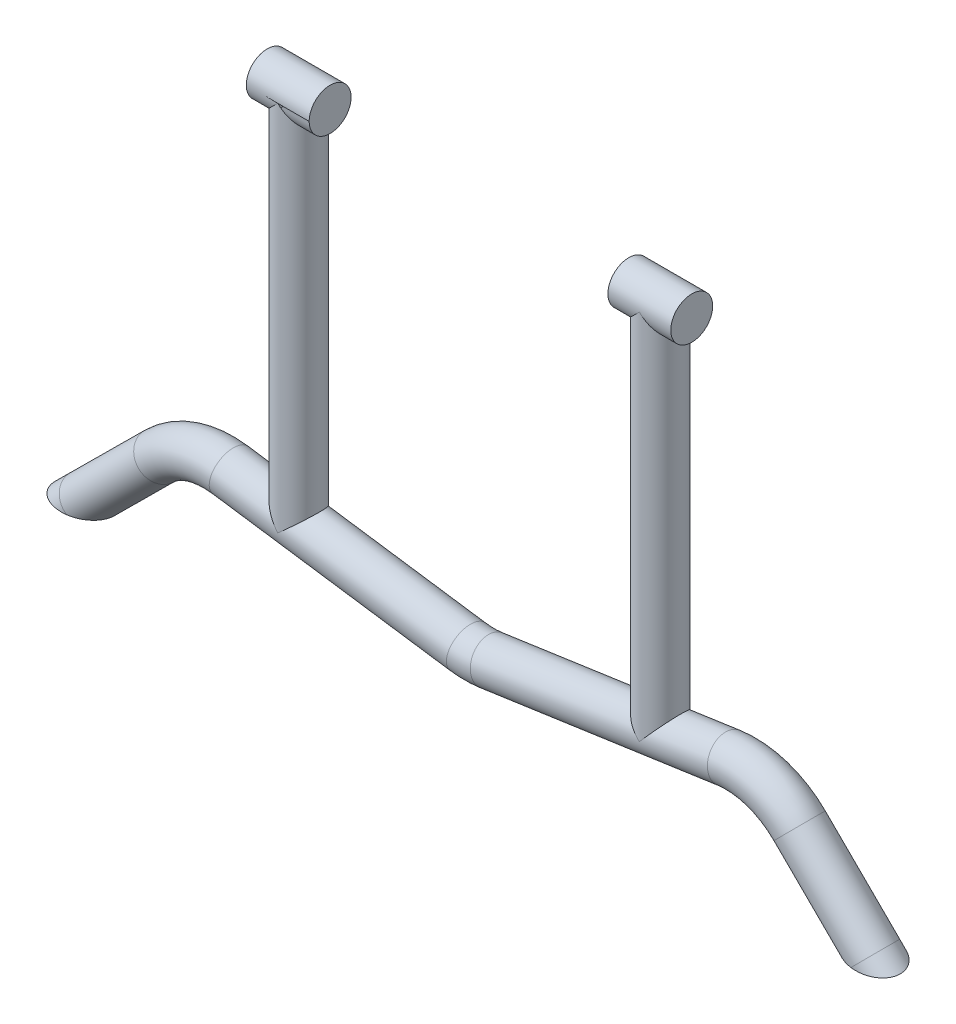
ISO-10303-21;
HEADER;
FILE_DESCRIPTION(('STEP AP214'),'2;1');
FILE_NAME('part.step','',(''),(''),'','','');
FILE_SCHEMA(('AUTOMOTIVE_DESIGN { 1 0 10303 214 1 1 1 1 }'));
ENDSEC;
DATA;
#1=APPLICATION_CONTEXT('core data for automotive mechanical design processes');
#2=APPLICATION_PROTOCOL_DEFINITION('international standard','automotive_design',2000,#1);
#3=PRODUCT_CONTEXT('',#1,'mechanical');
#4=PRODUCT('Part','Part','',(#3));
#5=PRODUCT_RELATED_PRODUCT_CATEGORY('part','',(#4));
#6=PRODUCT_DEFINITION_FORMATION('','',#4);
#7=PRODUCT_DEFINITION_CONTEXT('part definition',#1,'design');
#8=PRODUCT_DEFINITION('design','',#6,#7);
#9=PRODUCT_DEFINITION_SHAPE('','',#8);
#10=(LENGTH_UNIT() NAMED_UNIT(*) SI_UNIT(.MILLI.,.METRE.));
#11=(NAMED_UNIT(*) PLANE_ANGLE_UNIT() SI_UNIT($,.RADIAN.));
#12=(NAMED_UNIT(*) SI_UNIT($,.STERADIAN.) SOLID_ANGLE_UNIT());
#13=UNCERTAINTY_MEASURE_WITH_UNIT(LENGTH_MEASURE(1.E-05),#10,'distance_accuracy_value','');
#14=(GEOMETRIC_REPRESENTATION_CONTEXT(3) GLOBAL_UNCERTAINTY_ASSIGNED_CONTEXT((#13)) GLOBAL_UNIT_ASSIGNED_CONTEXT((#10,
#11,#12)) REPRESENTATION_CONTEXT('',''));
#15=CARTESIAN_POINT('',(0.,0.,0.));
#16=DIRECTION('',(0.,0.,1.));
#17=DIRECTION('',(1.,0.,0.));
#18=AXIS2_PLACEMENT_3D('',#15,#16,#17);
#19=CARTESIAN_POINT('',(-275.126088042944,-73.0145407718072,0.));
#20=DIRECTION('',(0.709733185353942,0.704470585338626,0.));
#21=DIRECTION('',(-0.704470585338626,0.709733185353943,0.));
#22=AXIS2_PLACEMENT_3D('',#19,#20,#21);
#23=CYLINDRICAL_SURFACE('',#22,12.7);
#24=CARTESIAN_POINT('',(-239.071642226962,-37.2274350366032,0.));
#25=DIRECTION('',(0.,-0.992546151641322,-0.121869343405149));
#26=DIRECTION('',(0.992762977114858,0.0146353215024942,-0.119195128401132));
#27=AXIS2_PLACEMENT_3D('',#24,#25,#26);
#28=ELLIPSE('',#27,18.1631072320455,12.7);
#29=CARTESIAN_POINT('',(-237.546495886726,-38.7639746632629,12.5141110198276));
#30=VERTEX_POINT('',#29);
#31=CARTESIAN_POINT('',(-240.596788567205,-35.6908954099436,-12.5141110198267));
#32=VERTEX_POINT('',#31);
#33=EDGE_CURVE('E82',#30,#32,#28,.T.);
#34=ORIENTED_EDGE('',*,*,#33,.F.);
#35=CARTESIAN_POINT('',(-239.071642226964,-37.2274350366051,0.));
#36=DIRECTION('',(-0.709733185353944,-0.704470585338624,0.));
#37=DIRECTION('',(0.704470585338624,-0.709733185353944,0.));
#38=AXIS2_PLACEMENT_3D('',#35,#36,#37);
#39=CIRCLE('',#38,12.7);
#40=EDGE_CURVE('E135',#30,#32,#39,.T.);
#41=ORIENTED_EDGE('',*,*,#40,.T.);
#42=EDGE_LOOP('',(#34,#41));
#43=FACE_BOUND('',#42,.T.);
#44=ADVANCED_FACE('F69',(#43),#23,.T.);
#45=CARTESIAN_POINT('',(-239.071642226964,-37.2274350366051,0.));
#46=DIRECTION('',(0.709733185353942,0.704470585338626,0.));
#47=DIRECTION('',(-0.704470585338626,0.709733185353942,0.));
#48=AXIS2_PLACEMENT_3D('',#45,#46,#47);
#49=CYLINDRICAL_SURFACE('',#48,12.7);
#50=CARTESIAN_POINT('',(-193.952445621405,7.55720727496356,0.));
#51=DIRECTION('',(-0.709733185353944,-0.704470585338624,0.));
#52=DIRECTION('',(0.704470585338624,-0.709733185353944,0.));
#53=AXIS2_PLACEMENT_3D('',#50,#51,#52);
#54=CIRCLE('',#53,12.7);
#55=CARTESIAN_POINT('',(-202.899222055205,16.5708187289587,0.));
#56=VERTEX_POINT('',#55);
#57=EDGE_CURVE('E139',#56,#56,#54,.T.);
#58=ORIENTED_EDGE('',*,*,#57,.T.);
#59=EDGE_LOOP('',(#58));
#60=FACE_BOUND('',#59,.T.);
#61=CARTESIAN_POINT('',(-239.071642226962,-37.2274350366032,0.));
#62=DIRECTION('',(0.,-0.992546151641322,-0.121869343405149));
#63=DIRECTION('',(0.992762977114858,0.0146353215024942,-0.119195128401132));
#64=AXIS2_PLACEMENT_3D('',#61,#62,#63);
#65=ELLIPSE('',#64,18.1631072320455,12.7);
#66=EDGE_CURVE('E12',#32,#30,#65,.T.);
#67=ORIENTED_EDGE('',*,*,#66,.F.);
#68=ORIENTED_EDGE('',*,*,#40,.F.);
#69=EDGE_LOOP('',(#67,#68));
#70=FACE_BOUND('',#69,.T.);
#71=ADVANCED_FACE('F138',(#60,#70),#49,.T.);
#72=CARTESIAN_POINT('',(193.952445621405,7.55720727496451,0.));
#73=DIRECTION('',(0.709733185353948,-0.70447058533862,0.));
#74=DIRECTION('',(0.70447058533862,0.709733185353948,0.));
#75=AXIS2_PLACEMENT_3D('',#72,#73,#74);
#76=CYLINDRICAL_SURFACE('',#75,12.7);
#77=CARTESIAN_POINT('',(193.952445621405,7.55720727496462,0.));
#78=DIRECTION('',(-0.709733185353946,0.704470585338623,0.));
#79=DIRECTION('',(-0.704470585338623,-0.709733185353946,0.));
#80=AXIS2_PLACEMENT_3D('',#77,#78,#79);
#81=CIRCLE('',#80,12.7);
#82=CARTESIAN_POINT('',(202.899222055206,16.5708187289598,0.));
#83=VERTEX_POINT('',#82);
#84=EDGE_CURVE('E161',#83,#83,#81,.T.);
#85=ORIENTED_EDGE('',*,*,#84,.F.);
#86=EDGE_LOOP('',(#85));
#87=FACE_BOUND('',#86,.T.);
#88=CARTESIAN_POINT('',(239.071642226964,-37.2274350366032,0.));
#89=DIRECTION('',(0.,-0.992546151641322,-0.121869343405149));
#90=DIRECTION('',(0.992762977114858,-0.014635321502494,0.11919512840113));
#91=AXIS2_PLACEMENT_3D('',#88,#89,#90);
#92=ELLIPSE('',#91,18.1631072320456,12.7);
#93=CARTESIAN_POINT('',(237.546495886725,-38.7639746632629,12.5141110198272));
#94=VERTEX_POINT('',#93);
#95=CARTESIAN_POINT('',(240.596788567204,-35.6908954099435,-12.514111019827));
#96=VERTEX_POINT('',#95);
#97=EDGE_CURVE('E240',#94,#96,#92,.T.);
#98=ORIENTED_EDGE('',*,*,#97,.F.);
#99=CARTESIAN_POINT('',(239.071642226964,-37.2274350366036,0.));
#100=DIRECTION('',(-0.709733185353946,0.704470585338623,0.));
#101=DIRECTION('',(-0.704470585338623,-0.709733185353946,0.));
#102=AXIS2_PLACEMENT_3D('',#99,#100,#101);
#103=CIRCLE('',#102,12.7);
#104=EDGE_CURVE('E164',#94,#96,#103,.T.);
#105=ORIENTED_EDGE('',*,*,#104,.T.);
#106=EDGE_LOOP('',(#98,#105));
#107=FACE_BOUND('',#106,.T.);
#108=ADVANCED_FACE('F207',(#87,#107),#76,.T.);
#109=CARTESIAN_POINT('',(239.071642226964,-37.2274350366034,0.));
#110=DIRECTION('',(0.709733185353947,-0.704470585338621,0.));
#111=DIRECTION('',(0.704470585338621,0.709733185353947,0.));
#112=AXIS2_PLACEMENT_3D('',#109,#110,#111);
#113=CYLINDRICAL_SURFACE('',#112,12.7);
#114=CARTESIAN_POINT('',(239.071642226964,-37.2274350366032,0.));
#115=DIRECTION('',(0.,-0.992546151641322,-0.121869343405149));
#116=DIRECTION('',(0.992762977114858,-0.014635321502494,0.11919512840113));
#117=AXIS2_PLACEMENT_3D('',#114,#115,#116);
#118=ELLIPSE('',#117,18.1631072320456,12.7);
#119=EDGE_CURVE('E173',#96,#94,#118,.T.);
#120=ORIENTED_EDGE('',*,*,#119,.F.);
#121=ORIENTED_EDGE('',*,*,#104,.F.);
#122=EDGE_LOOP('',(#120,#121));
#123=FACE_BOUND('',#122,.T.);
#124=ADVANCED_FACE('F71',(#123),#113,.T.);
#125=CARTESIAN_POINT('',(-158.165339886203,-28.4972385410168,0.));
#126=DIRECTION('',(0.,0.,-1.));
#127=DIRECTION('',(-1.,0.,0.));
#128=AXIS2_PLACEMENT_3D('',#125,#126,#127);
#129=TOROIDAL_SURFACE('',#128,50.8000000000001,12.7);
#130=CARTESIAN_POINT('',(-150.90819702906,21.7817220444113,0.));
#131=DIRECTION('',(-0.989743318610787,0.142857142857137,0.));
#132=DIRECTION('',(-0.142857142857137,-0.989743318610788,0.));
#133=AXIS2_PLACEMENT_3D('',#130,#131,#132);
#134=CIRCLE('',#133,12.7);
#135=CARTESIAN_POINT('',(-149.093911314775,34.3514621907683,0.));
#136=VERTEX_POINT('',#135);
#137=EDGE_CURVE('E143',#136,#136,#134,.T.);
#138=CARTESIAN_POINT('',(-158.165339886203,-28.4972385410168,0.));
#139=DIRECTION('',(0.,0.,-1.));
#140=DIRECTION('',(-1.,0.,0.));
#141=AXIS2_PLACEMENT_3D('',#138,#139,#140);
#142=CIRCLE('',#141,63.5000000000001);
#143=EDGE_CURVE('',#56,#136,#142,.T.);
#144=ORIENTED_EDGE('',*,*,#57,.F.);
#145=ORIENTED_EDGE('',*,*,#137,.T.);
#146=ORIENTED_EDGE('',*,*,#143,.T.);
#147=ORIENTED_EDGE('',*,*,#143,.F.);
#148=EDGE_LOOP('',(#144,#146,#145,#147));
#149=FACE_BOUND('',#148,.T.);
#150=ADVANCED_FACE('F214',(#149),#129,.T.);
#151=CARTESIAN_POINT('',(-150.90819702906,21.7817220444114,0.));
#152=DIRECTION('',(0.989743318610788,-0.142857142857137,0.));
#153=DIRECTION('',(0.142857142857137,0.989743318610788,0.));
#154=AXIS2_PLACEMENT_3D('',#151,#152,#153);
#155=CYLINDRICAL_SURFACE('',#154,12.7);
#156=CARTESIAN_POINT('',(-109.5375,15.810376277839,0.));
#157=DIRECTION('',(0.65465367070798,-0.755928946018452,0.));
#158=DIRECTION('',(0.755928946018453,0.654653670707979,0.));
#159=AXIS2_PLACEMENT_3D('',#156,#157,#158);
#160=ELLIPSE('',#159,16.8005208252602,12.7);
#161=CARTESIAN_POINT('',(-109.537499999999,15.8103762778397,-12.7));
#162=VERTEX_POINT('',#161);
#163=CARTESIAN_POINT('',(-109.5375,15.810376277839,12.7));
#164=VERTEX_POINT('',#163);
#165=EDGE_CURVE('E175',#162,#164,#160,.T.);
#166=ORIENTED_EDGE('',*,*,#165,.T.);
#167=CARTESIAN_POINT('',(-109.5375,15.810376277839,0.));
#168=DIRECTION('',(0.755928946018453,0.654653670707979,0.));
#169=DIRECTION('',(0.65465367070798,-0.755928946018452,0.));
#170=AXIS2_PLACEMENT_3D('',#167,#168,#169);
#171=ELLIPSE('',#170,19.3995704419797,12.7);
#172=EDGE_CURVE('E77',#164,#162,#171,.F.);
#173=ORIENTED_EDGE('',*,*,#172,.T.);
#174=EDGE_LOOP('',(#166,#173));
#175=FACE_BOUND('',#174,.T.);
#176=CARTESIAN_POINT('',(-7.2571428571428,1.04747834552976,0.));
#177=DIRECTION('',(-0.989743318610787,0.142857142857139,0.));
#178=DIRECTION('',(-0.142857142857139,-0.989743318610787,0.));
#179=AXIS2_PLACEMENT_3D('',#176,#177,#178);
#180=CIRCLE('',#179,12.7);
#181=CARTESIAN_POINT('',(-9.07142857142849,-11.5222618008272,0.));
#182=VERTEX_POINT('',#181);
#183=EDGE_CURVE('E152',#182,#182,#180,.T.);
#184=ORIENTED_EDGE('',*,*,#183,.T.);
#185=EDGE_LOOP('',(#184));
#186=FACE_BOUND('',#185,.T.);
#187=ORIENTED_EDGE('',*,*,#137,.F.);
#188=EDGE_LOOP('',(#187));
#189=FACE_BOUND('',#188,.T.);
#190=ADVANCED_FACE('F179',(#175,#186,#189),#155,.T.);
#191=CARTESIAN_POINT('',(0.,51.3264389309578,0.));
#192=DIRECTION('',(0.,0.,1.));
#193=DIRECTION('',(1.,0.,0.));
#194=AXIS2_PLACEMENT_3D('',#191,#192,#193);
#195=TOROIDAL_SURFACE('',#194,50.8,12.7);
#196=CARTESIAN_POINT('',(7.25714285714288,1.04747834552982,0.));
#197=DIRECTION('',(-0.989743318610787,-0.14285714285714,0.));
#198=DIRECTION('',(0.14285714285714,-0.989743318610787,0.));
#199=AXIS2_PLACEMENT_3D('',#196,#197,#198);
#200=CIRCLE('',#199,12.7);
#201=CARTESIAN_POINT('',(9.0714285714286,-11.5222618008272,0.));
#202=VERTEX_POINT('',#201);
#203=EDGE_CURVE('E155',#202,#202,#200,.T.);
#204=CARTESIAN_POINT('',(0.,51.3264389309578,0.));
#205=DIRECTION('',(0.,0.,1.));
#206=DIRECTION('',(1.,0.,0.));
#207=AXIS2_PLACEMENT_3D('',#204,#205,#206);
#208=CIRCLE('',#207,63.5);
#209=EDGE_CURVE('',#182,#202,#208,.T.);
#210=ORIENTED_EDGE('',*,*,#183,.F.);
#211=ORIENTED_EDGE('',*,*,#203,.T.);
#212=ORIENTED_EDGE('',*,*,#209,.T.);
#213=ORIENTED_EDGE('',*,*,#209,.F.);
#214=EDGE_LOOP('',(#210,#212,#211,#213));
#215=FACE_BOUND('',#214,.T.);
#216=ADVANCED_FACE('F220',(#215),#195,.T.);
#217=CARTESIAN_POINT('',(7.25714285714288,1.04747834552982,0.));
#218=DIRECTION('',(0.989743318610787,0.142857142857143,0.));
#219=DIRECTION('',(-0.142857142857143,0.989743318610787,0.));
#220=AXIS2_PLACEMENT_3D('',#217,#218,#219);
#221=CYLINDRICAL_SURFACE('',#220,12.7);
#222=CARTESIAN_POINT('',(109.5375,15.8103762778397,0.));
#223=DIRECTION('',(0.755928946018455,-0.654653670707977,0.));
#224=DIRECTION('',(0.654653670707977,0.755928946018455,0.));
#225=AXIS2_PLACEMENT_3D('',#222,#223,#224);
#226=ELLIPSE('',#225,19.3995704419797,12.7);
#227=CARTESIAN_POINT('',(109.5375,15.8103762778397,-12.7));
#228=VERTEX_POINT('',#227);
#229=CARTESIAN_POINT('',(109.5375,15.8103762778397,12.7));
#230=VERTEX_POINT('',#229);
#231=EDGE_CURVE('E167',#228,#230,#226,.T.);
#232=ORIENTED_EDGE('',*,*,#231,.T.);
#233=CARTESIAN_POINT('',(109.5375,15.8103762778397,0.));
#234=DIRECTION('',(0.654653670707977,0.755928946018455,0.));
#235=DIRECTION('',(0.755928946018455,-0.654653670707977,0.));
#236=AXIS2_PLACEMENT_3D('',#233,#234,#235);
#237=ELLIPSE('',#236,16.8005208252602,12.7);
#238=EDGE_CURVE('E170',#230,#228,#237,.F.);
#239=ORIENTED_EDGE('',*,*,#238,.T.);
#240=EDGE_LOOP('',(#232,#239));
#241=FACE_BOUND('',#240,.T.);
#242=CARTESIAN_POINT('',(150.90819702906,21.7817220444123,0.));
#243=DIRECTION('',(-0.989743318610787,-0.142857142857141,0.));
#244=DIRECTION('',(0.142857142857141,-0.989743318610787,0.));
#245=AXIS2_PLACEMENT_3D('',#242,#243,#244);
#246=CIRCLE('',#245,12.7);
#247=CARTESIAN_POINT('',(149.093911314774,34.3514621907692,0.));
#248=VERTEX_POINT('',#247);
#249=EDGE_CURVE('E158',#248,#248,#246,.T.);
#250=ORIENTED_EDGE('',*,*,#249,.T.);
#251=EDGE_LOOP('',(#250));
#252=FACE_BOUND('',#251,.T.);
#253=ORIENTED_EDGE('',*,*,#203,.F.);
#254=EDGE_LOOP('',(#253));
#255=FACE_BOUND('',#254,.T.);
#256=ADVANCED_FACE('F223',(#241,#252,#255),#221,.T.);
#257=CARTESIAN_POINT('',(158.165339886203,-28.4972385410157,0.));
#258=DIRECTION('',(0.,0.,-1.));
#259=DIRECTION('',(-1.,0.,0.));
#260=AXIS2_PLACEMENT_3D('',#257,#258,#259);
#261=TOROIDAL_SURFACE('',#260,50.8,12.7);
#262=CARTESIAN_POINT('',(158.165339886203,-28.4972385410157,0.));
#263=DIRECTION('',(0.,0.,-1.));
#264=DIRECTION('',(-1.,0.,0.));
#265=AXIS2_PLACEMENT_3D('',#262,#263,#264);
#266=CIRCLE('',#265,63.5);
#267=EDGE_CURVE('',#248,#83,#266,.T.);
#268=ORIENTED_EDGE('',*,*,#249,.F.);
#269=ORIENTED_EDGE('',*,*,#84,.T.);
#270=ORIENTED_EDGE('',*,*,#267,.T.);
#271=ORIENTED_EDGE('',*,*,#267,.F.);
#272=EDGE_LOOP('',(#268,#270,#269,#271));
#273=FACE_BOUND('',#272,.T.);
#274=ADVANCED_FACE('F227',(#273),#261,.T.);
#275=CARTESIAN_POINT('',(109.5375,15.8103762778397,0.));
#276=DIRECTION('',(0.,1.,0.));
#277=DIRECTION('',(0.,0.,1.));
#278=AXIS2_PLACEMENT_3D('',#275,#276,#277);
#279=CYLINDRICAL_SURFACE('',#278,12.7);
#280=CARTESIAN_POINT('',(109.5375,241.23537627784,0.));
#281=DIRECTION('',(-0.707106781186548,0.707106781186547,0.));
#282=DIRECTION('',(0.707106781186547,0.707106781186548,0.));
#283=AXIS2_PLACEMENT_3D('',#280,#281,#282);
#284=ELLIPSE('',#283,17.9605122421383,12.7);
#285=CARTESIAN_POINT('',(109.5375,241.23537627784,-12.7));
#286=VERTEX_POINT('',#285);
#287=CARTESIAN_POINT('',(109.5375,241.23537627784,12.7));
#288=VERTEX_POINT('',#287);
#289=EDGE_CURVE('E140',#286,#288,#284,.T.);
#290=ORIENTED_EDGE('',*,*,#289,.F.);
#291=CARTESIAN_POINT('',(109.5375,241.23537627784,0.));
#292=DIRECTION('',(0.707106781186547,0.707106781186548,0.));
#293=DIRECTION('',(-0.707106781186548,0.707106781186547,0.));
#294=AXIS2_PLACEMENT_3D('',#291,#292,#293);
#295=ELLIPSE('',#294,17.9605122421383,12.7);
#296=EDGE_CURVE('E146',#288,#286,#295,.T.);
#297=ORIENTED_EDGE('',*,*,#296,.F.);
#298=EDGE_LOOP('',(#290,#297));
#299=FACE_BOUND('',#298,.T.);
#300=ORIENTED_EDGE('',*,*,#238,.F.);
#301=ORIENTED_EDGE('',*,*,#231,.F.);
#302=EDGE_LOOP('',(#300,#301));
#303=FACE_BOUND('',#302,.T.);
#304=ADVANCED_FACE('F211',(#299,#303),#279,.T.);
#305=CARTESIAN_POINT('',(128.5875,241.23537627784,0.));
#306=DIRECTION('',(-1.,0.,0.));
#307=DIRECTION('',(0.,0.,1.));
#308=AXIS2_PLACEMENT_3D('',#305,#306,#307);
#309=PLANE('',#308);
#310=CARTESIAN_POINT('',(128.5875,241.23537627784,0.));
#311=DIRECTION('',(-1.,0.,0.));
#312=DIRECTION('',(0.,0.,1.));
#313=AXIS2_PLACEMENT_3D('',#310,#311,#312);
#314=CIRCLE('',#313,12.7);
#315=CARTESIAN_POINT('',(128.5875,241.23537627784,12.7));
#316=VERTEX_POINT('',#315);
#317=EDGE_CURVE('E243',#316,#316,#314,.T.);
#318=ORIENTED_EDGE('',*,*,#317,.F.);
#319=EDGE_LOOP('',(#318));
#320=FACE_BOUND('',#319,.T.);
#321=ADVANCED_FACE('F198',(#320),#309,.F.);
#322=CARTESIAN_POINT('',(90.4875,241.23537627784,0.));
#323=DIRECTION('',(-1.,0.,0.));
#324=DIRECTION('',(0.,0.,1.));
#325=AXIS2_PLACEMENT_3D('',#322,#323,#324);
#326=PLANE('',#325);
#327=CARTESIAN_POINT('',(90.4875,241.23537627784,0.));
#328=DIRECTION('',(-1.,0.,0.));
#329=DIRECTION('',(0.,0.,1.));
#330=AXIS2_PLACEMENT_3D('',#327,#328,#329);
#331=CIRCLE('',#330,12.7);
#332=CARTESIAN_POINT('',(90.4875,241.23537627784,12.7));
#333=VERTEX_POINT('',#332);
#334=EDGE_CURVE('E247',#333,#333,#331,.T.);
#335=ORIENTED_EDGE('',*,*,#334,.T.);
#336=EDGE_LOOP('',(#335));
#337=FACE_BOUND('',#336,.T.);
#338=ADVANCED_FACE('F272',(#337),#326,.T.);
#339=CARTESIAN_POINT('',(128.5875,241.23537627784,0.));
#340=DIRECTION('',(-1.,0.,0.));
#341=DIRECTION('',(0.,-1.,0.));
#342=AXIS2_PLACEMENT_3D('',#339,#340,#341);
#343=CYLINDRICAL_SURFACE('',#342,12.7);
#344=ORIENTED_EDGE('',*,*,#296,.T.);
#345=ORIENTED_EDGE('',*,*,#289,.T.);
#346=EDGE_LOOP('',(#344,#345));
#347=FACE_BOUND('',#346,.T.);
#348=ORIENTED_EDGE('',*,*,#334,.F.);
#349=EDGE_LOOP('',(#348));
#350=FACE_BOUND('',#349,.T.);
#351=ORIENTED_EDGE('',*,*,#317,.T.);
#352=EDGE_LOOP('',(#351));
#353=FACE_BOUND('',#352,.T.);
#354=ADVANCED_FACE('F195',(#347,#350,#353),#343,.T.);
#355=CARTESIAN_POINT('',(234.496203206246,-41.8370539165823,37.5423330594815));
#356=DIRECTION('',(0.,-0.992546151641322,-0.121869343405149));
#357=DIRECTION('',(0.,0.121869343405149,-0.992546151641322));
#358=AXIS2_PLACEMENT_3D('',#355,#356,#357);
#359=PLANE('',#358);
#360=ORIENTED_EDGE('',*,*,#97,.T.);
#361=ORIENTED_EDGE('',*,*,#119,.T.);
#362=EDGE_LOOP('',(#360,#361));
#363=FACE_BOUND('',#362,.T.);
#364=ADVANCED_FACE('F185',(#363),#359,.T.);
#365=CARTESIAN_POINT('',(-109.5375,15.8103762778397,0.));
#366=DIRECTION('',(0.,1.,0.));
#367=DIRECTION('',(0.,0.,1.));
#368=AXIS2_PLACEMENT_3D('',#365,#366,#367);
#369=CYLINDRICAL_SURFACE('',#368,12.7);
#370=CARTESIAN_POINT('',(-109.5375,241.23537627784,0.));
#371=DIRECTION('',(0.707106781186548,0.707106781186547,0.));
#372=DIRECTION('',(-0.707106781186547,0.707106781186548,0.));
#373=AXIS2_PLACEMENT_3D('',#370,#371,#372);
#374=ELLIPSE('',#373,17.9605122421383,12.7);
#375=CARTESIAN_POINT('',(-109.5375,241.23537627784,12.7));
#376=VERTEX_POINT('',#375);
#377=CARTESIAN_POINT('',(-109.5375,241.23537627784,-12.7));
#378=VERTEX_POINT('',#377);
#379=EDGE_CURVE('E244',#376,#378,#374,.T.);
#380=ORIENTED_EDGE('',*,*,#379,.F.);
#381=CARTESIAN_POINT('',(-109.5375,241.23537627784,0.));
#382=DIRECTION('',(-0.707106781186547,0.707106781186548,0.));
#383=DIRECTION('',(0.707106781186548,0.707106781186547,0.));
#384=AXIS2_PLACEMENT_3D('',#381,#382,#383);
#385=ELLIPSE('',#384,17.9605122421383,12.7);
#386=EDGE_CURVE('E89',#378,#376,#385,.T.);
#387=ORIENTED_EDGE('',*,*,#386,.F.);
#388=EDGE_LOOP('',(#380,#387));
#389=FACE_BOUND('',#388,.T.);
#390=ORIENTED_EDGE('',*,*,#172,.F.);
#391=ORIENTED_EDGE('',*,*,#165,.F.);
#392=EDGE_LOOP('',(#390,#391));
#393=FACE_BOUND('',#392,.T.);
#394=ADVANCED_FACE('F182',(#389,#393),#369,.T.);
#395=CARTESIAN_POINT('',(-128.5875,241.23537627784,0.));
#396=DIRECTION('',(1.,0.,0.));
#397=DIRECTION('',(0.,0.,1.));
#398=AXIS2_PLACEMENT_3D('',#395,#396,#397);
#399=PLANE('',#398);
#400=CARTESIAN_POINT('',(-128.5875,241.23537627784,0.));
#401=DIRECTION('',(-1.,0.,0.));
#402=DIRECTION('',(0.,0.,1.));
#403=AXIS2_PLACEMENT_3D('',#400,#401,#402);
#404=CIRCLE('',#403,12.7);
#405=CARTESIAN_POINT('',(-128.5875,241.23537627784,12.7));
#406=VERTEX_POINT('',#405);
#407=EDGE_CURVE('E136',#406,#406,#404,.F.);
#408=ORIENTED_EDGE('',*,*,#407,.F.);
#409=EDGE_LOOP('',(#408));
#410=FACE_BOUND('',#409,.T.);
#411=ADVANCED_FACE('F184',(#410),#399,.F.);
#412=CARTESIAN_POINT('',(-90.4875,241.23537627784,0.));
#413=DIRECTION('',(1.,0.,0.));
#414=DIRECTION('',(0.,0.,1.));
#415=AXIS2_PLACEMENT_3D('',#412,#413,#414);
#416=PLANE('',#415);
#417=CARTESIAN_POINT('',(-90.4875,241.23537627784,0.));
#418=DIRECTION('',(-1.,0.,0.));
#419=DIRECTION('',(0.,0.,1.));
#420=AXIS2_PLACEMENT_3D('',#417,#418,#419);
#421=CIRCLE('',#420,12.7);
#422=CARTESIAN_POINT('',(-90.4875,241.23537627784,12.7));
#423=VERTEX_POINT('',#422);
#424=EDGE_CURVE('E392',#423,#423,#421,.F.);
#425=ORIENTED_EDGE('',*,*,#424,.T.);
#426=EDGE_LOOP('',(#425));
#427=FACE_BOUND('',#426,.T.);
#428=ADVANCED_FACE('F192',(#427),#416,.T.);
#429=CARTESIAN_POINT('',(-128.5875,241.23537627784,0.));
#430=DIRECTION('',(1.,0.,0.));
#431=DIRECTION('',(0.,1.,0.));
#432=AXIS2_PLACEMENT_3D('',#429,#430,#431);
#433=CYLINDRICAL_SURFACE('',#432,12.7);
#434=ORIENTED_EDGE('',*,*,#386,.T.);
#435=ORIENTED_EDGE('',*,*,#379,.T.);
#436=EDGE_LOOP('',(#434,#435));
#437=FACE_BOUND('',#436,.T.);
#438=ORIENTED_EDGE('',*,*,#424,.F.);
#439=EDGE_LOOP('',(#438));
#440=FACE_BOUND('',#439,.T.);
#441=ORIENTED_EDGE('',*,*,#407,.T.);
#442=EDGE_LOOP('',(#441));
#443=FACE_BOUND('',#442,.T.);
#444=ADVANCED_FACE('F187',(#437,#440,#443),#433,.T.);
#445=CARTESIAN_POINT('',(-234.496203206246,-41.8370539165823,37.5423330594815));
#446=DIRECTION('',(0.,-0.992546151641322,-0.121869343405149));
#447=DIRECTION('',(0.,0.121869343405149,-0.992546151641322));
#448=AXIS2_PLACEMENT_3D('',#445,#446,#447);
#449=PLANE('',#448);
#450=ORIENTED_EDGE('',*,*,#33,.T.);
#451=ORIENTED_EDGE('',*,*,#66,.T.);
#452=EDGE_LOOP('',(#450,#451));
#453=FACE_BOUND('',#452,.T.);
#454=ADVANCED_FACE('F130',(#453),#449,.T.);
#455=CLOSED_SHELL('',(#44,#71,#108,#124,#150,#190,#216,#256,#274,#304,#321,#338,#354,#364,#394,
#411,#428,#444,#454));
#456=MANIFOLD_SOLID_BREP('B2',#455);
#457=ADVANCED_BREP_SHAPE_REPRESENTATION('',(#18,#456),#14);
#458=SHAPE_DEFINITION_REPRESENTATION(#9,#457);
ENDSEC;
END-ISO-10303-21;
